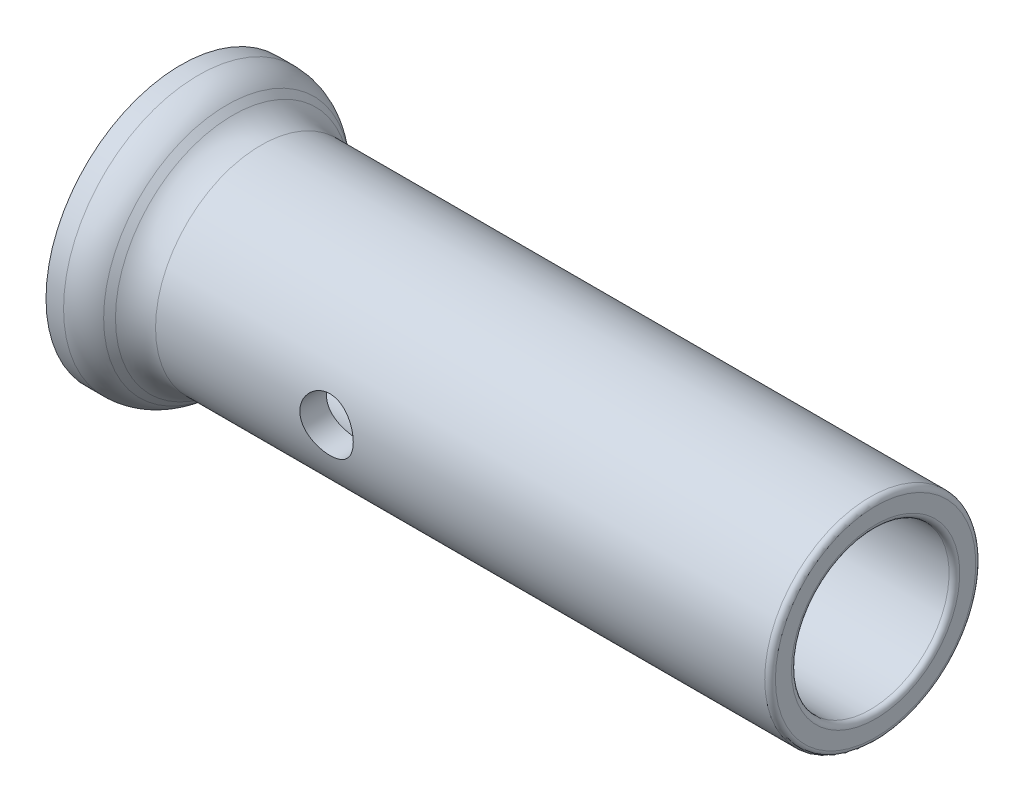
ISO-10303-21;
HEADER;
FILE_DESCRIPTION(('STEP AP214'),'2;1');
FILE_NAME('part.step','',(''),(''),'','','');
FILE_SCHEMA(('AUTOMOTIVE_DESIGN { 1 0 10303 214 1 1 1 1 }'));
ENDSEC;
DATA;
#1=APPLICATION_CONTEXT('core data for automotive mechanical design processes');
#2=APPLICATION_PROTOCOL_DEFINITION('international standard','automotive_design',2000,#1);
#3=PRODUCT_CONTEXT('',#1,'mechanical');
#4=PRODUCT('Part','Part','',(#3));
#5=PRODUCT_RELATED_PRODUCT_CATEGORY('part','',(#4));
#6=PRODUCT_DEFINITION_FORMATION('','',#4);
#7=PRODUCT_DEFINITION_CONTEXT('part definition',#1,'design');
#8=PRODUCT_DEFINITION('design','',#6,#7);
#9=PRODUCT_DEFINITION_SHAPE('','',#8);
#10=(LENGTH_UNIT() NAMED_UNIT(*) SI_UNIT(.MILLI.,.METRE.));
#11=(NAMED_UNIT(*) PLANE_ANGLE_UNIT() SI_UNIT($,.RADIAN.));
#12=(NAMED_UNIT(*) SI_UNIT($,.STERADIAN.) SOLID_ANGLE_UNIT());
#13=UNCERTAINTY_MEASURE_WITH_UNIT(LENGTH_MEASURE(1.E-05),#10,'distance_accuracy_value','');
#14=(GEOMETRIC_REPRESENTATION_CONTEXT(3) GLOBAL_UNCERTAINTY_ASSIGNED_CONTEXT((#13)) GLOBAL_UNIT_ASSIGNED_CONTEXT((#10,
#11,#12)) REPRESENTATION_CONTEXT('',''));
#15=CARTESIAN_POINT('',(0.,0.,0.));
#16=DIRECTION('',(0.,0.,1.));
#17=DIRECTION('',(1.,0.,0.));
#18=AXIS2_PLACEMENT_3D('',#15,#16,#17);
#19=CARTESIAN_POINT('',(-11.3005884112895,0.,0.));
#20=DIRECTION('',(-1.,0.,0.));
#21=DIRECTION('',(0.,0.,1.));
#22=AXIS2_PLACEMENT_3D('',#19,#20,#21);
#23=CYLINDRICAL_SURFACE('',#22,4.05);
#24=CARTESIAN_POINT('',(1.,0.,0.));
#25=DIRECTION('',(-1.,0.,0.));
#26=DIRECTION('',(0.,0.,1.));
#27=AXIS2_PLACEMENT_3D('',#24,#25,#26);
#28=CIRCLE('',#27,4.05);
#29=CARTESIAN_POINT('',(1.,0.,4.05));
#30=VERTEX_POINT('',#29);
#31=EDGE_CURVE('E76',#30,#30,#28,.T.);
#32=ORIENTED_EDGE('',*,*,#31,.F.);
#33=EDGE_LOOP('',(#32));
#34=FACE_BOUND('',#33,.T.);
#35=CARTESIAN_POINT('',(0.,0.,0.));
#36=DIRECTION('',(-1.,0.,0.));
#37=DIRECTION('',(0.,0.,1.));
#38=AXIS2_PLACEMENT_3D('',#35,#36,#37);
#39=CIRCLE('',#38,4.05);
#40=CARTESIAN_POINT('',(0.,0.,4.05));
#41=VERTEX_POINT('',#40);
#42=EDGE_CURVE('E10',#41,#41,#39,.T.);
#43=ORIENTED_EDGE('',*,*,#42,.T.);
#44=EDGE_LOOP('',(#43));
#45=FACE_BOUND('',#44,.T.);
#46=ADVANCED_FACE('F31',(#34,#45),#23,.F.);
#47=CARTESIAN_POINT('',(0.,4.05,0.));
#48=DIRECTION('',(1.,0.,0.));
#49=DIRECTION('',(0.,0.,-1.));
#50=AXIS2_PLACEMENT_3D('',#47,#48,#49);
#51=PLANE('',#50);
#52=ORIENTED_EDGE('',*,*,#42,.F.);
#53=EDGE_LOOP('',(#52));
#54=FACE_BOUND('',#53,.T.);
#55=CARTESIAN_POINT('',(0.,0.,0.));
#56=DIRECTION('',(-1.,0.,0.));
#57=DIRECTION('',(0.,0.,1.));
#58=AXIS2_PLACEMENT_3D('',#55,#56,#57);
#59=CIRCLE('',#58,5.05);
#60=CARTESIAN_POINT('',(0.,0.,5.05));
#61=VERTEX_POINT('',#60);
#62=EDGE_CURVE('E43',#61,#61,#59,.T.);
#63=ORIENTED_EDGE('',*,*,#62,.T.);
#64=EDGE_LOOP('',(#63));
#65=FACE_BOUND('',#64,.T.);
#66=ADVANCED_FACE('F121',(#54,#65),#51,.F.);
#67=CARTESIAN_POINT('',(-11.3005884112895,0.,0.));
#68=DIRECTION('',(-1.,0.,0.));
#69=DIRECTION('',(0.,0.,1.));
#70=AXIS2_PLACEMENT_3D('',#67,#68,#69);
#71=CYLINDRICAL_SURFACE('',#70,5.05);
#72=ORIENTED_EDGE('',*,*,#62,.F.);
#73=EDGE_LOOP('',(#72));
#74=FACE_BOUND('',#73,.T.);
#75=CARTESIAN_POINT('',(0.657359312880718,0.,0.));
#76=DIRECTION('',(-1.,0.,0.));
#77=DIRECTION('',(0.,0.,1.));
#78=AXIS2_PLACEMENT_3D('',#75,#76,#77);
#79=CIRCLE('',#78,5.05);
#80=CARTESIAN_POINT('',(0.657359312880718,0.,5.05));
#81=VERTEX_POINT('',#80);
#82=EDGE_CURVE('E47',#81,#81,#79,.T.);
#83=ORIENTED_EDGE('',*,*,#82,.T.);
#84=EDGE_LOOP('',(#83));
#85=FACE_BOUND('',#84,.T.);
#86=ADVANCED_FACE('F126',(#74,#85),#71,.T.);
#87=CARTESIAN_POINT('',(0.657359312880718,0.,0.));
#88=DIRECTION('',(-1.,0.,0.));
#89=DIRECTION('',(0.,0.,1.));
#90=AXIS2_PLACEMENT_3D('',#87,#88,#89);
#91=TOROIDAL_SURFACE('',#90,3.55,1.5);
#92=ORIENTED_EDGE('',*,*,#82,.F.);
#93=EDGE_LOOP('',(#92));
#94=FACE_BOUND('',#93,.T.);
#95=CARTESIAN_POINT('',(1.71801948466054,0.,0.));
#96=DIRECTION('',(-1.,0.,0.));
#97=DIRECTION('',(0.,0.,1.));
#98=AXIS2_PLACEMENT_3D('',#95,#96,#97);
#99=CIRCLE('',#98,4.61066017177982);
#100=CARTESIAN_POINT('',(1.71801948466054,0.,4.61066017177982));
#101=VERTEX_POINT('',#100);
#102=EDGE_CURVE('E52',#101,#101,#99,.T.);
#103=ORIENTED_EDGE('',*,*,#102,.T.);
#104=EDGE_LOOP('',(#103));
#105=FACE_BOUND('',#104,.T.);
#106=ADVANCED_FACE('F133',(#94,#105),#91,.T.);
#107=CARTESIAN_POINT('',(1.93933982822018,0.,0.));
#108=DIRECTION('',(-1.,0.,0.));
#109=DIRECTION('',(0.,0.,1.));
#110=AXIS2_PLACEMENT_3D('',#107,#108,#109);
#111=CONICAL_SURFACE('',#110,4.38933982822018,0.785398163397452);
#112=ORIENTED_EDGE('',*,*,#102,.F.);
#113=EDGE_LOOP('',(#112));
#114=FACE_BOUND('',#113,.T.);
#115=CARTESIAN_POINT('',(1.93933982822018,0.,0.));
#116=DIRECTION('',(-1.,0.,0.));
#117=DIRECTION('',(0.,0.,1.));
#118=AXIS2_PLACEMENT_3D('',#115,#116,#117);
#119=CIRCLE('',#118,4.38933982822018);
#120=CARTESIAN_POINT('',(1.93933982822018,0.,4.38933982822018));
#121=VERTEX_POINT('',#120);
#122=EDGE_CURVE('E55',#121,#121,#119,.T.);
#123=ORIENTED_EDGE('',*,*,#122,.T.);
#124=EDGE_LOOP('',(#123));
#125=FACE_BOUND('',#124,.T.);
#126=ADVANCED_FACE('F140',(#114,#125),#111,.T.);
#127=CARTESIAN_POINT('',(3.,0.,0.));
#128=DIRECTION('',(-1.,0.,0.));
#129=DIRECTION('',(0.,0.,1.));
#130=AXIS2_PLACEMENT_3D('',#127,#128,#129);
#131=TOROIDAL_SURFACE('',#130,5.45,1.5);
#132=ORIENTED_EDGE('',*,*,#122,.F.);
#133=EDGE_LOOP('',(#132));
#134=FACE_BOUND('',#133,.T.);
#135=CARTESIAN_POINT('',(3.,0.,0.));
#136=DIRECTION('',(-1.,0.,0.));
#137=DIRECTION('',(0.,0.,1.));
#138=AXIS2_PLACEMENT_3D('',#135,#136,#137);
#139=CIRCLE('',#138,3.95);
#140=CARTESIAN_POINT('',(3.,0.,3.95));
#141=VERTEX_POINT('',#140);
#142=EDGE_CURVE('E58',#141,#141,#139,.T.);
#143=ORIENTED_EDGE('',*,*,#142,.T.);
#144=EDGE_LOOP('',(#143));
#145=FACE_BOUND('',#144,.T.);
#146=ADVANCED_FACE('F116',(#134,#145),#131,.F.);
#147=CARTESIAN_POINT('',(-11.3005884112895,0.,0.));
#148=DIRECTION('',(-1.,0.,0.));
#149=DIRECTION('',(0.,0.,1.));
#150=AXIS2_PLACEMENT_3D('',#147,#148,#149);
#151=CYLINDRICAL_SURFACE('',#150,3.95);
#152=CARTESIAN_POINT('',(10.4,0.,3.95));
#153=CARTESIAN_POINT('',(10.3999984919513,-0.0552278420748468,3.94999908204684));
#154=CARTESIAN_POINT('',(10.3954094463953,-0.110472396400866,3.94883021486781));
#155=CARTESIAN_POINT('',(10.37720292985,-0.219376684770793,3.9442806794472));
#156=CARTESIAN_POINT('',(10.363580485316,-0.273035528756149,3.94089879279058));
#157=CARTESIAN_POINT('',(10.3277734243036,-0.377180122437892,3.93229748362604));
#158=CARTESIAN_POINT('',(10.305599231305,-0.427669648348492,3.92708029878769));
#159=CARTESIAN_POINT('',(10.253355156036,-0.524212415434037,3.91536323222111));
#160=CARTESIAN_POINT('',(10.2232849584381,-0.570265479338115,3.90886329926882));
#161=CARTESIAN_POINT('',(10.1554330059679,-0.657598787580674,3.89513247989479));
#162=CARTESIAN_POINT('',(10.1175160639065,-0.698772196504417,3.88789008700224));
#163=CARTESIAN_POINT('',(10.0353362974195,-0.774248675231094,3.87356657479428));
#164=CARTESIAN_POINT('',(9.99107273956107,-0.808550949886453,3.86648547422801));
#165=CARTESIAN_POINT('',(9.89662238533746,-0.869817310360343,3.85316997858545));
#166=CARTESIAN_POINT('',(9.84635541535428,-0.8966612577612,3.8469501747132));
#167=CARTESIAN_POINT('',(9.74183928759349,-0.941476144800428,3.83622956373611));
#168=CARTESIAN_POINT('',(9.68759078602261,-0.959448542826902,3.83172847412055));
#169=CARTESIAN_POINT('',(9.57782785604774,-0.98564447800774,3.82507328273172));
#170=CARTESIAN_POINT('',(9.52236221381551,-0.994060408757434,3.82287293653175));
#171=CARTESIAN_POINT('',(9.41076603027492,-1.00150389012776,3.82092998774723));
#172=CARTESIAN_POINT('',(9.35463560164393,-1.0005330096412,3.82118697444891));
#173=CARTESIAN_POINT('',(9.24478270311336,-0.989383789300828,3.82408811953594));
#174=CARTESIAN_POINT('',(9.19103507820566,-0.97943535862688,3.826672667255));
#175=CARTESIAN_POINT('',(9.08599767170283,-0.9509804658599,3.83384263855054));
#176=CARTESIAN_POINT('',(9.03470806947546,-0.932473380267745,3.83842820790033));
#177=CARTESIAN_POINT('',(8.93542933500218,-0.887232199279389,3.84913783092387));
#178=CARTESIAN_POINT('',(8.8874797148559,-0.860415192377697,3.85527726966644));
#179=CARTESIAN_POINT('',(8.79667892145032,-0.799373363875983,3.86839426326203));
#180=CARTESIAN_POINT('',(8.75382866334816,-0.765147215691904,3.87537196810434));
#181=CARTESIAN_POINT('',(8.67312615646522,-0.689070600726191,3.88962974437686));
#182=CARTESIAN_POINT('',(8.63545691065745,-0.64702629279569,3.89691268804759));
#183=CARTESIAN_POINT('',(8.56766857722189,-0.557129757116954,3.91077635595212));
#184=CARTESIAN_POINT('',(8.53754973193502,-0.509277343022367,3.91735705764256));
#185=CARTESIAN_POINT('',(8.48564750727798,-0.408857714757763,3.92910890000827));
#186=CARTESIAN_POINT('',(8.46389448076683,-0.356274170552657,3.93427488867099));
#187=CARTESIAN_POINT('',(8.42958812707898,-0.248036539264749,3.94257781835689));
#188=CARTESIAN_POINT('',(8.41703299394499,-0.192383057256602,3.94571515768035));
#189=CARTESIAN_POINT('',(8.4017597574516,-0.0811494612569943,3.94954811388858));
#190=CARTESIAN_POINT('',(8.39879251744885,-0.0256056354836756,3.95030555646106));
#191=CARTESIAN_POINT('',(8.40209510880267,0.0851851389097107,3.94946977470528));
#192=CARTESIAN_POINT('',(8.40836408603732,0.140432114506925,3.94787676773552));
#193=CARTESIAN_POINT('',(8.42975597918696,0.248190844735719,3.94255875874206));
#194=CARTESIAN_POINT('',(8.44474241559262,0.300731462997949,3.93886663987927));
#195=CARTESIAN_POINT('',(8.48298744611331,0.402549796122122,3.92976700717265));
#196=CARTESIAN_POINT('',(8.50624688775546,0.451827176068224,3.92435931758351));
#197=CARTESIAN_POINT('',(8.56085665649059,0.54670717204759,3.91228090485967));
#198=CARTESIAN_POINT('',(8.59234578221967,0.592227150944135,3.90558909631277));
#199=CARTESIAN_POINT('',(8.66234419267327,0.677425134789227,3.89171704587319));
#200=CARTESIAN_POINT('',(8.70085472145263,0.717102102215167,3.88453671756594));
#201=CARTESIAN_POINT('',(8.78496068560975,0.790518789323266,3.87027341917479));
#202=CARTESIAN_POINT('',(8.83071030112566,0.824083545405221,3.86319747090773));
#203=CARTESIAN_POINT('',(8.92733910684638,0.883059964621525,3.85014558107988));
#204=CARTESIAN_POINT('',(8.97821807076087,0.908471987221513,3.84416959102531));
#205=CARTESIAN_POINT('',(9.08339100494804,0.950231584598357,3.83406073969026));
#206=CARTESIAN_POINT('',(9.13766257957136,0.966632792137008,3.82991700223302));
#207=CARTESIAN_POINT('',(9.24831420738048,0.990044181657133,3.82393269795229));
#208=CARTESIAN_POINT('',(9.30469378241328,0.997056480178925,3.82209161204859));
#209=CARTESIAN_POINT('',(9.4161786121732,1.00137829764814,3.82096134400262));
#210=CARTESIAN_POINT('',(9.47127244041182,0.998967740557092,3.82159853697847));
#211=CARTESIAN_POINT('',(9.58024058639087,0.985154533235012,3.82518240754788));
#212=CARTESIAN_POINT('',(9.63411492983508,0.973752072713339,3.82812903641743));
#213=CARTESIAN_POINT('',(9.7388015753129,0.94243340484457,3.83595820613519));
#214=CARTESIAN_POINT('',(9.78963094106241,0.922570964111818,3.8408285072964));
#215=CARTESIAN_POINT('',(9.88727252322743,0.874938511416824,3.85195770365967));
#216=CARTESIAN_POINT('',(9.9340841672814,0.847167375213228,3.85821679625402));
#217=CARTESIAN_POINT('',(10.0237111284221,0.783633699377764,3.87162721456458));
#218=CARTESIAN_POINT('',(10.0663863039087,0.747677518801082,3.8787979067106));
#219=CARTESIAN_POINT('',(10.1451882925208,0.669170094379429,3.8931093778377));
#220=CARTESIAN_POINT('',(10.1813135421814,0.626617280405067,3.90025014928039));
#221=CARTESIAN_POINT('',(10.2466500449191,0.535163954139942,3.91385664534171));
#222=CARTESIAN_POINT('',(10.2757193487147,0.486159605851861,3.92030724668928));
#223=CARTESIAN_POINT('',(10.3251609888441,0.383800172167366,3.93164601340821));
#224=CARTESIAN_POINT('',(10.3455394380465,0.330448176331422,3.93653527636488));
#225=CARTESIAN_POINT('',(10.3740634112027,0.231008135572119,3.9434943052563));
#226=CARTESIAN_POINT('',(10.3837683239816,0.18538580462664,3.94591699651009));
#227=CARTESIAN_POINT('',(10.396736999342,0.0931795635500852,3.94917016803465));
#228=CARTESIAN_POINT('',(10.4000012723407,0.0465957299132146,3.95000077447707));
#229=CARTESIAN_POINT('',(10.4,0.,3.95));
#230=B_SPLINE_CURVE_WITH_KNOTS('',3,(#152,#153,#154,#155,#156,#157,#158,#159,#160,#161,#162,
#163,#164,#165,#166,#167,#168,#169,#170,#171,#172,#173,#174,#175,#176,#177,#178,#179,#180,#181,
#182,#183,#184,#185,#186,#187,#188,#189,#190,#191,#192,#193,#194,#195,#196,#197,#198,#199,#200,
#201,#202,#203,#204,#205,#206,#207,#208,#209,#210,#211,#212,#213,#214,#215,#216,#217,#218,#219,
#220,#221,#222,#223,#224,#225,#226,#227,#228,#229),.UNSPECIFIED.,.T.,.F.,(4,2,2,2,2,2,2,2,2,2,2,
2,2,2,2,2,2,2,2,2,2,2,2,2,2,2,2,2,2,2,2,2,2,2,2,2,2,2,4),(0.,0.165512747530337,
0.331116697640764,0.496519432574112,0.661928773883153,0.830468884011723,0.999028486836981,
1.17016372163742,1.34127081425357,1.50886841059758,1.6764379954995,1.83983434666397,
2.00324260314946,2.16833681236569,2.3334606056793,2.50341757273773,2.67337999411054,
2.84395338273746,3.01449327120702,3.18056455367168,3.34662047960914,3.51014407075122,
3.6736844188773,3.84018425250062,4.00671361534652,4.17744263350461,4.34816412294206,
4.51785814720793,4.6875139109316,4.85216858434356,5.01681978399747,5.18043981589751,
5.3440831184249,5.51209741294958,5.68015175977973,5.85134922932129,6.02242608465511,
6.16208025636818,6.3017233601249),.UNSPECIFIED.);
#231=CARTESIAN_POINT('',(10.4,0.,3.95));
#232=VERTEX_POINT('',#231);
#233=EDGE_CURVE('E79',#232,#232,#230,.T.);
#234=ORIENTED_EDGE('',*,*,#233,.T.);
#235=EDGE_LOOP('',(#234));
#236=FACE_BOUND('',#235,.T.);
#237=ORIENTED_EDGE('',*,*,#142,.F.);
#238=EDGE_LOOP('',(#237));
#239=FACE_BOUND('',#238,.T.);
#240=CARTESIAN_POINT('',(25.8,0.,0.));
#241=DIRECTION('',(-1.,0.,0.));
#242=DIRECTION('',(0.,0.,1.));
#243=AXIS2_PLACEMENT_3D('',#240,#241,#242);
#244=CIRCLE('',#243,3.95);
#245=CARTESIAN_POINT('',(25.8,0.,3.95));
#246=VERTEX_POINT('',#245);
#247=EDGE_CURVE('E61',#246,#246,#244,.T.);
#248=ORIENTED_EDGE('',*,*,#247,.T.);
#249=EDGE_LOOP('',(#248));
#250=FACE_BOUND('',#249,.T.);
#251=ADVANCED_FACE('F85',(#236,#239,#250),#151,.T.);
#252=CARTESIAN_POINT('',(25.8,0.,0.));
#253=DIRECTION('',(-1.,0.,0.));
#254=DIRECTION('',(0.,0.,1.));
#255=AXIS2_PLACEMENT_3D('',#252,#253,#254);
#256=TOROIDAL_SURFACE('',#255,3.75,0.2);
#257=ORIENTED_EDGE('',*,*,#247,.F.);
#258=EDGE_LOOP('',(#257));
#259=FACE_BOUND('',#258,.T.);
#260=CARTESIAN_POINT('',(26.,0.,0.));
#261=DIRECTION('',(-1.,0.,0.));
#262=DIRECTION('',(0.,0.,1.));
#263=AXIS2_PLACEMENT_3D('',#260,#261,#262);
#264=CIRCLE('',#263,3.75);
#265=CARTESIAN_POINT('',(26.,0.,3.75));
#266=VERTEX_POINT('',#265);
#267=EDGE_CURVE('E64',#266,#266,#264,.T.);
#268=ORIENTED_EDGE('',*,*,#267,.T.);
#269=EDGE_LOOP('',(#268));
#270=FACE_BOUND('',#269,.T.);
#271=ADVANCED_FACE('F109',(#259,#270),#256,.T.);
#272=CARTESIAN_POINT('',(26.,3.75,0.));
#273=DIRECTION('',(-1.,0.,0.));
#274=DIRECTION('',(0.,0.,1.));
#275=AXIS2_PLACEMENT_3D('',#272,#273,#274);
#276=PLANE('',#275);
#277=ORIENTED_EDGE('',*,*,#267,.F.);
#278=EDGE_LOOP('',(#277));
#279=FACE_BOUND('',#278,.T.);
#280=CARTESIAN_POINT('',(26.,0.,0.));
#281=DIRECTION('',(-1.,0.,0.));
#282=DIRECTION('',(0.,0.,1.));
#283=AXIS2_PLACEMENT_3D('',#280,#281,#282);
#284=CIRCLE('',#283,3.15);
#285=CARTESIAN_POINT('',(26.,0.,3.15));
#286=VERTEX_POINT('',#285);
#287=EDGE_CURVE('E67',#286,#286,#284,.T.);
#288=ORIENTED_EDGE('',*,*,#287,.T.);
#289=EDGE_LOOP('',(#288));
#290=FACE_BOUND('',#289,.T.);
#291=ADVANCED_FACE('F106',(#279,#290),#276,.F.);
#292=CARTESIAN_POINT('',(25.8,0.,0.));
#293=DIRECTION('',(-1.,0.,0.));
#294=DIRECTION('',(0.,0.,1.));
#295=AXIS2_PLACEMENT_3D('',#292,#293,#294);
#296=TOROIDAL_SURFACE('',#295,3.15,0.200000000000001);
#297=ORIENTED_EDGE('',*,*,#287,.F.);
#298=EDGE_LOOP('',(#297));
#299=FACE_BOUND('',#298,.T.);
#300=CARTESIAN_POINT('',(25.8,0.,0.));
#301=DIRECTION('',(-1.,0.,0.));
#302=DIRECTION('',(0.,0.,1.));
#303=AXIS2_PLACEMENT_3D('',#300,#301,#302);
#304=CIRCLE('',#303,2.95);
#305=CARTESIAN_POINT('',(25.8,0.,2.95));
#306=VERTEX_POINT('',#305);
#307=EDGE_CURVE('E70',#306,#306,#304,.T.);
#308=ORIENTED_EDGE('',*,*,#307,.T.);
#309=EDGE_LOOP('',(#308));
#310=FACE_BOUND('',#309,.T.);
#311=ADVANCED_FACE('F102',(#299,#310),#296,.T.);
#312=CARTESIAN_POINT('',(-11.3005884112895,0.,0.));
#313=DIRECTION('',(-1.,0.,0.));
#314=DIRECTION('',(0.,0.,1.));
#315=AXIS2_PLACEMENT_3D('',#312,#313,#314);
#316=CYLINDRICAL_SURFACE('',#315,2.95);
#317=CARTESIAN_POINT('',(10.4,0.,2.95));
#318=CARTESIAN_POINT('',(10.4000004431119,0.0545105942007189,2.95000029145323));
#319=CARTESIAN_POINT('',(10.3955284565171,0.109018159605019,2.94847528228185));
#320=CARTESIAN_POINT('',(10.3778156564071,0.216424634263978,2.94254220100316));
#321=CARTESIAN_POINT('',(10.3645742272838,0.269323430311579,2.93813392649312));
#322=CARTESIAN_POINT('',(10.329830796994,0.371948437480398,2.92691256858244));
#323=CARTESIAN_POINT('',(10.30834288664,0.421679892567579,2.92010358888568));
#324=CARTESIAN_POINT('',(10.2577811856413,0.516832633719903,2.90477359776747));
#325=CARTESIAN_POINT('',(10.2287058197798,0.562253022099601,2.89625223092528));
#326=CARTESIAN_POINT('',(10.1627060349666,0.649114506456161,2.87805212517247));
#327=CARTESIAN_POINT('',(10.125559290104,0.690380683942871,2.86834498138472));
#328=CARTESIAN_POINT('',(10.0449437612303,0.766232300597829,2.84902142411235));
#329=CARTESIAN_POINT('',(10.0014735245799,0.800816200444481,2.8394050320173));
#330=CARTESIAN_POINT('',(9.90785301001318,0.863334427116425,2.8210369811525));
#331=CARTESIAN_POINT('',(9.85754178479005,0.891038849022136,2.81231980220228));
#332=CARTESIAN_POINT('',(9.75263099165502,0.937517979182632,2.7971703642847));
#333=CARTESIAN_POINT('',(9.69803279005227,0.956295519186465,2.79073738089826));
#334=CARTESIAN_POINT('',(9.58809069126239,0.983727158375595,2.78118438099379));
#335=CARTESIAN_POINT('',(9.53283838388081,0.992709878628599,2.77795716747215));
#336=CARTESIAN_POINT('',(9.42152381305751,1.00132430200658,2.77486442926218));
#337=CARTESIAN_POINT('',(9.36546181592742,1.00095901276314,2.77499782333068));
#338=CARTESIAN_POINT('',(9.25694690176606,0.991142426596308,2.77851748109882));
#339=CARTESIAN_POINT('',(9.20444899458246,0.982123280106034,2.78174902529329));
#340=CARTESIAN_POINT('',(9.10176102657653,0.955961201291614,2.79084718738855));
#341=CARTESIAN_POINT('',(9.05157125178363,0.938817265083652,2.79671413090967));
#342=CARTESIAN_POINT('',(8.95395567753871,0.896615470659463,2.81052999703594));
#343=CARTESIAN_POINT('',(8.90658915933264,0.871431681072123,2.81851167992763));
#344=CARTESIAN_POINT('',(8.8166192304174,0.813952497428975,2.83564432870023));
#345=CARTESIAN_POINT('',(8.77401723852563,0.781654993453515,2.84479564115325));
#346=CARTESIAN_POINT('',(8.6923617706474,0.708802410900542,2.86384170465827));
#347=CARTESIAN_POINT('',(8.65362505736164,0.667895067787686,2.87374988855844));
#348=CARTESIAN_POINT('',(8.58347738657488,0.580043724493489,2.89276108171158));
#349=CARTESIAN_POINT('',(8.5520671805718,0.533099105819369,2.90186400830793));
#350=CARTESIAN_POINT('',(8.49719740717318,0.433816526300885,2.91836574353378));
#351=CARTESIAN_POINT('',(8.47382535388824,0.381426819797735,2.92574552997507));
#352=CARTESIAN_POINT('',(8.43632528891014,0.2731489276323,2.93783107442794));
#353=CARTESIAN_POINT('',(8.42219395147473,0.217262008563374,2.94253779439834));
#354=CARTESIAN_POINT('',(8.40414376510709,0.106255730020249,2.94858626021517));
#355=CARTESIAN_POINT('',(8.39979708813533,0.0512135225540003,2.95006887300376));
#356=CARTESIAN_POINT('',(8.40021740085274,-0.0588264167007467,2.94992621550636));
#357=CARTESIAN_POINT('',(8.40498279242117,-0.113824154596116,2.94830149020105));
#358=CARTESIAN_POINT('',(8.42315498255285,-0.220484091349986,2.94221974696513));
#359=CARTESIAN_POINT('',(8.43629690990466,-0.272196862531276,2.93784959987832));
#360=CARTESIAN_POINT('',(8.47051570301197,-0.372660887428652,2.92680371325276));
#361=CARTESIAN_POINT('',(8.49159358673075,-0.421411760283174,2.92012767794154));
#362=CARTESIAN_POINT('',(8.54171038303797,-0.516024725809124,2.90492292611899));
#363=CARTESIAN_POINT('',(8.57094742327391,-0.561774455970628,2.89634937221122));
#364=CARTESIAN_POINT('',(8.63632109906455,-0.647856248499979,2.87831889193654));
#365=CARTESIAN_POINT('',(8.6724599048338,-0.688186599966311,2.86886168819079));
#366=CARTESIAN_POINT('',(8.75262204996125,-0.764261935456543,2.84956437810692));
#367=CARTESIAN_POINT('',(8.79693645853112,-0.799701706965582,2.83972720323154));
#368=CARTESIAN_POINT('',(8.89109293112331,-0.862682533128118,2.82123372566443));
#369=CARTESIAN_POINT('',(8.94093508695055,-0.890223456570155,2.81257744259031));
#370=CARTESIAN_POINT('',(9.04479518232469,-0.936512653561718,2.79750590572115));
#371=CARTESIAN_POINT('',(9.09880719420529,-0.955273150279017,2.79108753973357));
#372=CARTESIAN_POINT('',(9.20949315509845,-0.983342710747911,2.78132383589306));
#373=CARTESIAN_POINT('',(9.26616583704176,-0.99265622653465,2.77797705058134));
#374=CARTESIAN_POINT('',(9.37732715256414,-1.0012130412189,2.77490377995049));
#375=CARTESIAN_POINT('',(9.43177202608039,-1.00096466168768,2.77499454598799));
#376=CARTESIAN_POINT('',(9.53980064019606,-0.991662453519265,2.77833213287195));
#377=CARTESIAN_POINT('',(9.59338443523365,-0.982609183779362,2.78157875339805));
#378=CARTESIAN_POINT('',(9.6970828949493,-0.956319110319581,2.79072393876645));
#379=CARTESIAN_POINT('',(9.74724593290943,-0.939252370092525,2.79656726385443));
#380=CARTESIAN_POINT('',(9.84403414168795,-0.897558955070586,2.81022541613495));
#381=CARTESIAN_POINT('',(9.89065850766784,-0.872930566836286,2.81804069009168));
#382=CARTESIAN_POINT('',(9.98131353863496,-0.815524784033993,2.83519909106955));
#383=CARTESIAN_POINT('',(10.0251340564012,-0.782431417487263,2.84459502582165));
#384=CARTESIAN_POINT('',(10.1067638004903,-0.709563253946507,2.86364041951063));
#385=CARTESIAN_POINT('',(10.1445712940718,-0.669786537813098,2.87328995059496));
#386=CARTESIAN_POINT('',(10.2146601367096,-0.582731818354927,2.89222829691784));
#387=CARTESIAN_POINT('',(10.2466528498294,-0.535213861139581,2.90148630083584));
#388=CARTESIAN_POINT('',(10.3021644961136,-0.435166420690442,2.9181667911611));
#389=CARTESIAN_POINT('',(10.3256852535389,-0.382638019437335,2.92558967261604));
#390=CARTESIAN_POINT('',(10.3628034562465,-0.275855804130924,2.93754850740182));
#391=CARTESIAN_POINT('',(10.3767061746949,-0.221718263426618,2.94217262446317));
#392=CARTESIAN_POINT('',(10.3953028373984,-0.111719073250952,2.94839776770193));
#393=CARTESIAN_POINT('',(10.3999995459356,-0.0558579464385239,2.94999970134285));
#394=CARTESIAN_POINT('',(10.4,0.,2.95));
#395=B_SPLINE_CURVE_WITH_KNOTS('',3,(#317,#318,#319,#320,#321,#322,#323,#324,#325,#326,#327,
#328,#329,#330,#331,#332,#333,#334,#335,#336,#337,#338,#339,#340,#341,#342,#343,#344,#345,#346,
#347,#348,#349,#350,#351,#352,#353,#354,#355,#356,#357,#358,#359,#360,#361,#362,#363,#364,#365,
#366,#367,#368,#369,#370,#371,#372,#373,#374,#375,#376,#377,#378,#379,#380,#381,#382,#383,#384,
#385,#386,#387,#388,#389,#390,#391,#392,#393,#394),.UNSPECIFIED.,.T.,.F.,(4,2,2,2,2,2,2,2,2,2,2,
2,2,2,2,2,2,2,2,2,2,2,2,2,2,2,2,2,2,2,2,2,2,2,2,2,2,2,4),(0.,0.163326163829832,
0.326663794245684,0.489723562440059,0.65281721011977,0.821155186128154,0.989531894162838,
1.16294623953724,1.33630553835416,1.50365030097474,1.67094122271476,1.83029057834212,
1.989659628013,2.15165868113474,2.31370584785114,2.4845217535855,2.65535517263155,
2.82799363774169,3.00056993586089,3.16544045199785,3.33028205496084,3.49015366619605,
3.65004579151897,3.814220943994,3.97844780551216,4.15040529467121,4.32236564013113,
4.49408588355601,4.66572516352205,4.82825316593057,4.99077085242026,5.14998549601005,
5.30923624366533,5.47563018101018,5.6420719806756,5.81530911598365,5.98850892591587,
6.15592234094365,6.32328547915534),.UNSPECIFIED.);
#396=CARTESIAN_POINT('',(10.4,0.,2.95));
#397=VERTEX_POINT('',#396);
#398=EDGE_CURVE('E34',#397,#397,#395,.T.);
#399=ORIENTED_EDGE('',*,*,#398,.T.);
#400=EDGE_LOOP('',(#399));
#401=FACE_BOUND('',#400,.T.);
#402=ORIENTED_EDGE('',*,*,#307,.F.);
#403=EDGE_LOOP('',(#402));
#404=FACE_BOUND('',#403,.T.);
#405=CARTESIAN_POINT('',(1.,0.,0.));
#406=DIRECTION('',(-1.,0.,0.));
#407=DIRECTION('',(0.,0.,1.));
#408=AXIS2_PLACEMENT_3D('',#405,#406,#407);
#409=CIRCLE('',#408,2.95);
#410=CARTESIAN_POINT('',(1.,0.,2.95));
#411=VERTEX_POINT('',#410);
#412=EDGE_CURVE('E73',#411,#411,#409,.T.);
#413=ORIENTED_EDGE('',*,*,#412,.T.);
#414=EDGE_LOOP('',(#413));
#415=FACE_BOUND('',#414,.T.);
#416=ADVANCED_FACE('F97',(#401,#404,#415),#316,.F.);
#417=CARTESIAN_POINT('',(1.,2.95,0.));
#418=DIRECTION('',(1.,0.,0.));
#419=DIRECTION('',(0.,0.,-1.));
#420=AXIS2_PLACEMENT_3D('',#417,#418,#419);
#421=PLANE('',#420);
#422=ORIENTED_EDGE('',*,*,#412,.F.);
#423=EDGE_LOOP('',(#422));
#424=FACE_BOUND('',#423,.T.);
#425=ORIENTED_EDGE('',*,*,#31,.T.);
#426=EDGE_LOOP('',(#425));
#427=FACE_BOUND('',#426,.T.);
#428=ADVANCED_FACE('F93',(#424,#427),#421,.F.);
#429=CARTESIAN_POINT('',(9.4,0.,0.));
#430=DIRECTION('',(0.,0.,-1.));
#431=DIRECTION('',(-1.,0.,0.));
#432=AXIS2_PLACEMENT_3D('',#429,#430,#431);
#433=CYLINDRICAL_SURFACE('',#432,0.999999999999999);
#434=ORIENTED_EDGE('',*,*,#398,.F.);
#435=EDGE_LOOP('',(#434));
#436=FACE_BOUND('',#435,.T.);
#437=ORIENTED_EDGE('',*,*,#233,.F.);
#438=EDGE_LOOP('',(#437));
#439=FACE_BOUND('',#438,.T.);
#440=ADVANCED_FACE('F89',(#436,#439),#433,.F.);
#441=CLOSED_SHELL('',(#46,#66,#86,#106,#126,#146,#251,#271,#291,#311,#416,#428,#440));
#442=MANIFOLD_SOLID_BREP('B2',#441);
#443=ADVANCED_BREP_SHAPE_REPRESENTATION('',(#18,#442),#14);
#444=SHAPE_DEFINITION_REPRESENTATION(#9,#443);
ENDSEC;
END-ISO-10303-21;
